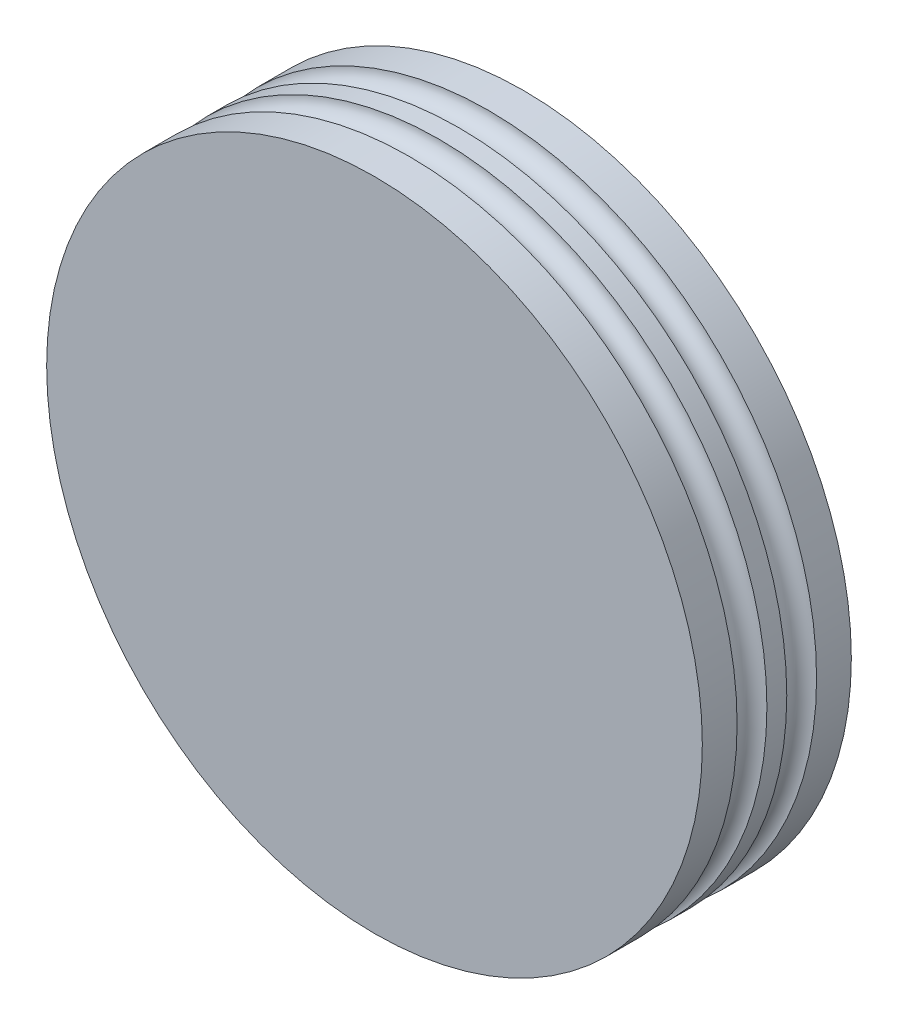
ISO-10303-21;
HEADER;
FILE_DESCRIPTION(('STEP AP214'),'2;1');
FILE_NAME('part.step','',(''),(''),'','','');
FILE_SCHEMA(('AUTOMOTIVE_DESIGN { 1 0 10303 214 1 1 1 1 }'));
ENDSEC;
DATA;
#1=APPLICATION_CONTEXT('core data for automotive mechanical design processes');
#2=APPLICATION_PROTOCOL_DEFINITION('international standard','automotive_design',2000,#1);
#3=PRODUCT_CONTEXT('',#1,'mechanical');
#4=PRODUCT('Part','Part','',(#3));
#5=PRODUCT_RELATED_PRODUCT_CATEGORY('part','',(#4));
#6=PRODUCT_DEFINITION_FORMATION('','',#4);
#7=PRODUCT_DEFINITION_CONTEXT('part definition',#1,'design');
#8=PRODUCT_DEFINITION('design','',#6,#7);
#9=PRODUCT_DEFINITION_SHAPE('','',#8);
#10=(LENGTH_UNIT() NAMED_UNIT(*) SI_UNIT(.MILLI.,.METRE.));
#11=(NAMED_UNIT(*) PLANE_ANGLE_UNIT() SI_UNIT($,.RADIAN.));
#12=(NAMED_UNIT(*) SI_UNIT($,.STERADIAN.) SOLID_ANGLE_UNIT());
#13=UNCERTAINTY_MEASURE_WITH_UNIT(LENGTH_MEASURE(1.E-05),#10,'distance_accuracy_value','');
#14=(GEOMETRIC_REPRESENTATION_CONTEXT(3) GLOBAL_UNCERTAINTY_ASSIGNED_CONTEXT((#13)) GLOBAL_UNIT_ASSIGNED_CONTEXT((#10,
#11,#12)) REPRESENTATION_CONTEXT('',''));
#15=CARTESIAN_POINT('',(0.,0.,0.));
#16=DIRECTION('',(0.,0.,1.));
#17=DIRECTION('',(1.,0.,0.));
#18=AXIS2_PLACEMENT_3D('',#15,#16,#17);
#19=CARTESIAN_POINT('',(0.,0.,0.));
#20=DIRECTION('',(0.,0.,1.));
#21=DIRECTION('',(1.,0.,0.));
#22=AXIS2_PLACEMENT_3D('',#19,#20,#21);
#23=PLANE('',#22);
#24=CARTESIAN_POINT('',(0.,0.,0.));
#25=DIRECTION('',(0.,0.,1.));
#26=DIRECTION('',(1.,0.,0.));
#27=AXIS2_PLACEMENT_3D('',#24,#25,#26);
#28=CIRCLE('',#27,5.);
#29=CARTESIAN_POINT('',(5.,0.,0.));
#30=VERTEX_POINT('',#29);
#31=EDGE_CURVE('E42',#30,#30,#28,.T.);
#32=ORIENTED_EDGE('',*,*,#31,.F.);
#33=EDGE_LOOP('',(#32));
#34=FACE_BOUND('',#33,.T.);
#35=CARTESIAN_POINT('',(0.,0.,0.));
#36=DIRECTION('',(0.,0.,1.));
#37=DIRECTION('',(1.,0.,0.));
#38=AXIS2_PLACEMENT_3D('',#35,#36,#37);
#39=CIRCLE('',#38,3.);
#40=CARTESIAN_POINT('',(-2.23606797749979,2.,0.));
#41=VERTEX_POINT('',#40);
#42=CARTESIAN_POINT('',(-2.23606797749979,-2.,0.));
#43=VERTEX_POINT('',#42);
#44=EDGE_CURVE('E50',#41,#43,#39,.T.);
#45=ORIENTED_EDGE('',*,*,#44,.T.);
#46=DIRECTION('',(1.,0.,0.));
#47=VECTOR('',#46,1.);
#48=CARTESIAN_POINT('',(-2.23606797749979,-2.,0.));
#49=LINE('',#48,#47);
#50=CARTESIAN_POINT('',(2.23606797749979,-2.,0.));
#51=VERTEX_POINT('',#50);
#52=EDGE_CURVE('E79',#43,#51,#49,.T.);
#53=ORIENTED_EDGE('',*,*,#52,.T.);
#54=CARTESIAN_POINT('',(0.,0.,0.));
#55=DIRECTION('',(0.,0.,1.));
#56=DIRECTION('',(1.,0.,0.));
#57=AXIS2_PLACEMENT_3D('',#54,#55,#56);
#58=CIRCLE('',#57,3.);
#59=CARTESIAN_POINT('',(2.23606797749979,2.,0.));
#60=VERTEX_POINT('',#59);
#61=EDGE_CURVE('E88',#51,#60,#58,.T.);
#62=ORIENTED_EDGE('',*,*,#61,.T.);
#63=DIRECTION('',(-1.,0.,0.));
#64=VECTOR('',#63,1.);
#65=CARTESIAN_POINT('',(-2.23606797749979,2.,0.));
#66=LINE('',#65,#64);
#67=EDGE_CURVE('E94',#60,#41,#66,.T.);
#68=ORIENTED_EDGE('',*,*,#67,.T.);
#69=EDGE_LOOP('',(#45,#53,#62,#68));
#70=FACE_BOUND('',#69,.T.);
#71=ADVANCED_FACE('F33',(#34,#70),#23,.F.);
#72=CARTESIAN_POINT('',(0.,0.,10.));
#73=DIRECTION('',(0.,0.,-1.));
#74=DIRECTION('',(-1.,0.,0.));
#75=AXIS2_PLACEMENT_3D('',#72,#73,#74);
#76=CYLINDRICAL_SURFACE('',#75,5.);
#77=CARTESIAN_POINT('',(0.,0.,10.));
#78=DIRECTION('',(0.,0.,1.));
#79=DIRECTION('',(1.,0.,0.));
#80=AXIS2_PLACEMENT_3D('',#77,#78,#79);
#81=CIRCLE('',#80,5.);
#82=CARTESIAN_POINT('',(5.,0.,10.));
#83=VERTEX_POINT('',#82);
#84=EDGE_CURVE('E11',#83,#83,#81,.T.);
#85=ORIENTED_EDGE('',*,*,#84,.F.);
#86=EDGE_LOOP('',(#85));
#87=FACE_BOUND('',#86,.T.);
#88=ORIENTED_EDGE('',*,*,#31,.T.);
#89=EDGE_LOOP('',(#88));
#90=FACE_BOUND('',#89,.T.);
#91=ADVANCED_FACE('F35',(#87,#90),#76,.T.);
#92=CARTESIAN_POINT('',(0.,0.,10.));
#93=DIRECTION('',(0.,0.,-1.));
#94=DIRECTION('',(-1.,0.,0.));
#95=AXIS2_PLACEMENT_3D('',#92,#93,#94);
#96=CYLINDRICAL_SURFACE('',#95,3.);
#97=ORIENTED_EDGE('',*,*,#44,.F.);
#98=DIRECTION('',(0.,0.,-1.));
#99=VECTOR('',#98,1.);
#100=CARTESIAN_POINT('',(-2.23606797749979,2.,10.));
#101=LINE('',#100,#99);
#102=CARTESIAN_POINT('',(-2.23606797749979,2.,10.));
#103=VERTEX_POINT('',#102);
#104=EDGE_CURVE('E102',#103,#41,#101,.T.);
#105=ORIENTED_EDGE('',*,*,#104,.F.);
#106=CARTESIAN_POINT('',(0.,0.,10.));
#107=DIRECTION('',(0.,0.,1.));
#108=DIRECTION('',(1.,0.,0.));
#109=AXIS2_PLACEMENT_3D('',#106,#107,#108);
#110=CIRCLE('',#109,3.);
#111=CARTESIAN_POINT('',(-2.23606797749979,-2.,10.));
#112=VERTEX_POINT('',#111);
#113=EDGE_CURVE('E59',#103,#112,#110,.T.);
#114=ORIENTED_EDGE('',*,*,#113,.T.);
#115=DIRECTION('',(0.,0.,-1.));
#116=VECTOR('',#115,1.);
#117=CARTESIAN_POINT('',(-2.23606797749979,-2.,10.));
#118=LINE('',#117,#116);
#119=EDGE_CURVE('E84',#112,#43,#118,.T.);
#120=ORIENTED_EDGE('',*,*,#119,.T.);
#121=EDGE_LOOP('',(#97,#105,#114,#120));
#122=FACE_BOUND('',#121,.T.);
#123=ADVANCED_FACE('F146',(#122),#96,.F.);
#124=CARTESIAN_POINT('',(-2.23606797749979,-2.,10.));
#125=DIRECTION('',(0.,1.,0.));
#126=DIRECTION('',(0.,0.,1.));
#127=AXIS2_PLACEMENT_3D('',#124,#125,#126);
#128=PLANE('',#127);
#129=ORIENTED_EDGE('',*,*,#52,.F.);
#130=ORIENTED_EDGE('',*,*,#119,.F.);
#131=DIRECTION('',(1.,0.,0.));
#132=VECTOR('',#131,1.);
#133=CARTESIAN_POINT('',(-2.23606797749979,-2.,10.));
#134=LINE('',#133,#132);
#135=CARTESIAN_POINT('',(2.23606797749979,-2.,10.));
#136=VERTEX_POINT('',#135);
#137=EDGE_CURVE('E81',#112,#136,#134,.T.);
#138=ORIENTED_EDGE('',*,*,#137,.T.);
#139=DIRECTION('',(0.,0.,-1.));
#140=VECTOR('',#139,1.);
#141=CARTESIAN_POINT('',(2.23606797749979,-2.,10.));
#142=LINE('',#141,#140);
#143=EDGE_CURVE('E74',#136,#51,#142,.T.);
#144=ORIENTED_EDGE('',*,*,#143,.T.);
#145=EDGE_LOOP('',(#129,#130,#138,#144));
#146=FACE_BOUND('',#145,.T.);
#147=ADVANCED_FACE('F76',(#146),#128,.T.);
#148=CARTESIAN_POINT('',(0.,0.,10.));
#149=DIRECTION('',(0.,0.,-1.));
#150=DIRECTION('',(-1.,0.,0.));
#151=AXIS2_PLACEMENT_3D('',#148,#149,#150);
#152=CYLINDRICAL_SURFACE('',#151,3.);
#153=ORIENTED_EDGE('',*,*,#61,.F.);
#154=ORIENTED_EDGE('',*,*,#143,.F.);
#155=CARTESIAN_POINT('',(0.,0.,10.));
#156=DIRECTION('',(0.,0.,1.));
#157=DIRECTION('',(1.,0.,0.));
#158=AXIS2_PLACEMENT_3D('',#155,#156,#157);
#159=CIRCLE('',#158,3.);
#160=CARTESIAN_POINT('',(2.23606797749979,2.,10.));
#161=VERTEX_POINT('',#160);
#162=EDGE_CURVE('E183',#136,#161,#159,.T.);
#163=ORIENTED_EDGE('',*,*,#162,.T.);
#164=DIRECTION('',(0.,0.,-1.));
#165=VECTOR('',#164,1.);
#166=CARTESIAN_POINT('',(2.23606797749979,2.,10.));
#167=LINE('',#166,#165);
#168=EDGE_CURVE('E85',#161,#60,#167,.T.);
#169=ORIENTED_EDGE('',*,*,#168,.T.);
#170=EDGE_LOOP('',(#153,#154,#163,#169));
#171=FACE_BOUND('',#170,.T.);
#172=ADVANCED_FACE('F89',(#171),#152,.F.);
#173=CARTESIAN_POINT('',(-2.23606797749979,2.,10.));
#174=DIRECTION('',(0.,-1.,0.));
#175=DIRECTION('',(0.,0.,-1.));
#176=AXIS2_PLACEMENT_3D('',#173,#174,#175);
#177=PLANE('',#176);
#178=ORIENTED_EDGE('',*,*,#67,.F.);
#179=ORIENTED_EDGE('',*,*,#168,.F.);
#180=DIRECTION('',(-1.,0.,0.));
#181=VECTOR('',#180,1.);
#182=CARTESIAN_POINT('',(-2.23606797749979,2.,10.));
#183=LINE('',#182,#181);
#184=EDGE_CURVE('E104',#161,#103,#183,.T.);
#185=ORIENTED_EDGE('',*,*,#184,.T.);
#186=ORIENTED_EDGE('',*,*,#104,.T.);
#187=EDGE_LOOP('',(#178,#179,#185,#186));
#188=FACE_BOUND('',#187,.T.);
#189=ADVANCED_FACE('F156',(#188),#177,.T.);
#190=CARTESIAN_POINT('',(0.,0.,10.));
#191=DIRECTION('',(0.,0.,1.));
#192=DIRECTION('',(1.,0.,0.));
#193=AXIS2_PLACEMENT_3D('',#190,#191,#192);
#194=PLANE('',#193);
#195=ORIENTED_EDGE('',*,*,#113,.F.);
#196=ORIENTED_EDGE('',*,*,#184,.F.);
#197=ORIENTED_EDGE('',*,*,#162,.F.);
#198=ORIENTED_EDGE('',*,*,#137,.F.);
#199=EDGE_LOOP('',(#195,#196,#197,#198));
#200=FACE_BOUND('',#199,.T.);
#201=ADVANCED_FACE('F158',(#200),#194,.F.);
#202=CARTESIAN_POINT('',(0.,0.,10.));
#203=DIRECTION('',(0.,0.,1.));
#204=DIRECTION('',(1.,0.,0.));
#205=AXIS2_PLACEMENT_3D('',#202,#203,#204);
#206=CIRCLE('',#205,33.);
#207=CARTESIAN_POINT('',(33.,0.,10.));
#208=VERTEX_POINT('',#207);
#209=EDGE_CURVE('E114',#208,#208,#206,.T.);
#210=ORIENTED_EDGE('',*,*,#209,.F.);
#211=EDGE_LOOP('',(#210));
#212=FACE_BOUND('',#211,.T.);
#213=ORIENTED_EDGE('',*,*,#84,.T.);
#214=EDGE_LOOP('',(#213));
#215=FACE_BOUND('',#214,.T.);
#216=ADVANCED_FACE('F162',(#212,#215),#194,.F.);
#217=CARTESIAN_POINT('',(0.,0.,25.));
#218=DIRECTION('',(0.,0.,-1.));
#219=DIRECTION('',(-1.,0.,0.));
#220=AXIS2_PLACEMENT_3D('',#217,#218,#219);
#221=CYLINDRICAL_SURFACE('',#220,33.);
#222=CARTESIAN_POINT('',(0.,0.,13.5));
#223=DIRECTION('',(0.,0.,1.));
#224=DIRECTION('',(1.,0.,0.));
#225=AXIS2_PLACEMENT_3D('',#222,#223,#224);
#226=CIRCLE('',#225,33.);
#227=CARTESIAN_POINT('',(33.,0.,13.5));
#228=VERTEX_POINT('',#227);
#229=EDGE_CURVE('E109',#228,#228,#226,.F.);
#230=ORIENTED_EDGE('',*,*,#229,.T.);
#231=EDGE_LOOP('',(#230));
#232=FACE_BOUND('',#231,.T.);
#233=ORIENTED_EDGE('',*,*,#209,.T.);
#234=EDGE_LOOP('',(#233));
#235=FACE_BOUND('',#234,.T.);
#236=ADVANCED_FACE('F139',(#232,#235),#221,.T.);
#237=CARTESIAN_POINT('',(0.,0.,15.));
#238=DIRECTION('',(0.,0.,1.));
#239=DIRECTION('',(1.,0.,0.));
#240=AXIS2_PLACEMENT_3D('',#237,#238,#239);
#241=TOROIDAL_SURFACE('',#240,33.,1.5);
#242=ORIENTED_EDGE('',*,*,#229,.F.);
#243=EDGE_LOOP('',(#242));
#244=FACE_BOUND('',#243,.T.);
#245=CARTESIAN_POINT('',(0.,0.,16.5));
#246=DIRECTION('',(0.,0.,-1.));
#247=DIRECTION('',(-1.,0.,0.));
#248=AXIS2_PLACEMENT_3D('',#245,#246,#247);
#249=CIRCLE('',#248,33.);
#250=CARTESIAN_POINT('',(-33.,0.,16.5));
#251=VERTEX_POINT('',#250);
#252=EDGE_CURVE('E112',#251,#251,#249,.F.);
#253=ORIENTED_EDGE('',*,*,#252,.F.);
#254=EDGE_LOOP('',(#253));
#255=FACE_BOUND('',#254,.T.);
#256=ADVANCED_FACE('F137',(#244,#255),#241,.F.);
#257=CARTESIAN_POINT('',(0.,0.,18.5));
#258=DIRECTION('',(0.,0.,1.));
#259=DIRECTION('',(1.,0.,0.));
#260=AXIS2_PLACEMENT_3D('',#257,#258,#259);
#261=CIRCLE('',#260,33.);
#262=CARTESIAN_POINT('',(33.,0.,18.5));
#263=VERTEX_POINT('',#262);
#264=EDGE_CURVE('E115',#263,#263,#261,.F.);
#265=ORIENTED_EDGE('',*,*,#264,.T.);
#266=EDGE_LOOP('',(#265));
#267=FACE_BOUND('',#266,.T.);
#268=ORIENTED_EDGE('',*,*,#252,.T.);
#269=EDGE_LOOP('',(#268));
#270=FACE_BOUND('',#269,.T.);
#271=ADVANCED_FACE('F128',(#267,#270),#221,.T.);
#272=CARTESIAN_POINT('',(0.,0.,20.));
#273=DIRECTION('',(0.,0.,1.));
#274=DIRECTION('',(1.,0.,0.));
#275=AXIS2_PLACEMENT_3D('',#272,#273,#274);
#276=TOROIDAL_SURFACE('',#275,33.,1.5);
#277=ORIENTED_EDGE('',*,*,#264,.F.);
#278=EDGE_LOOP('',(#277));
#279=FACE_BOUND('',#278,.T.);
#280=CARTESIAN_POINT('',(0.,0.,21.5));
#281=DIRECTION('',(0.,0.,-1.));
#282=DIRECTION('',(-1.,0.,0.));
#283=AXIS2_PLACEMENT_3D('',#280,#281,#282);
#284=CIRCLE('',#283,33.);
#285=CARTESIAN_POINT('',(-33.,0.,21.5));
#286=VERTEX_POINT('',#285);
#287=EDGE_CURVE('E37',#286,#286,#284,.F.);
#288=ORIENTED_EDGE('',*,*,#287,.F.);
#289=EDGE_LOOP('',(#288));
#290=FACE_BOUND('',#289,.T.);
#291=ADVANCED_FACE('F125',(#279,#290),#276,.F.);
#292=CARTESIAN_POINT('',(0.,0.,25.));
#293=DIRECTION('',(0.,0.,1.));
#294=DIRECTION('',(1.,0.,0.));
#295=AXIS2_PLACEMENT_3D('',#292,#293,#294);
#296=PLANE('',#295);
#297=CARTESIAN_POINT('',(0.,0.,25.));
#298=DIRECTION('',(0.,0.,1.));
#299=DIRECTION('',(1.,0.,0.));
#300=AXIS2_PLACEMENT_3D('',#297,#298,#299);
#301=CIRCLE('',#300,33.);
#302=CARTESIAN_POINT('',(33.,0.,25.));
#303=VERTEX_POINT('',#302);
#304=EDGE_CURVE('E97',#303,#303,#301,.T.);
#305=ORIENTED_EDGE('',*,*,#304,.T.);
#306=EDGE_LOOP('',(#305));
#307=FACE_BOUND('',#306,.T.);
#308=ADVANCED_FACE('F127',(#307),#296,.T.);
#309=ORIENTED_EDGE('',*,*,#287,.T.);
#310=EDGE_LOOP('',(#309));
#311=FACE_BOUND('',#310,.T.);
#312=ORIENTED_EDGE('',*,*,#304,.F.);
#313=EDGE_LOOP('',(#312));
#314=FACE_BOUND('',#313,.T.);
#315=ADVANCED_FACE('F122',(#311,#314),#221,.T.);
#316=CLOSED_SHELL('',(#71,#91,#123,#147,#172,#189,#201,#216,#236,#256,#271,#291,#308,#315));
#317=MANIFOLD_SOLID_BREP('B2',#316);
#318=ADVANCED_BREP_SHAPE_REPRESENTATION('',(#18,#317),#14);
#319=SHAPE_DEFINITION_REPRESENTATION(#9,#318);
ENDSEC;
END-ISO-10303-21;
